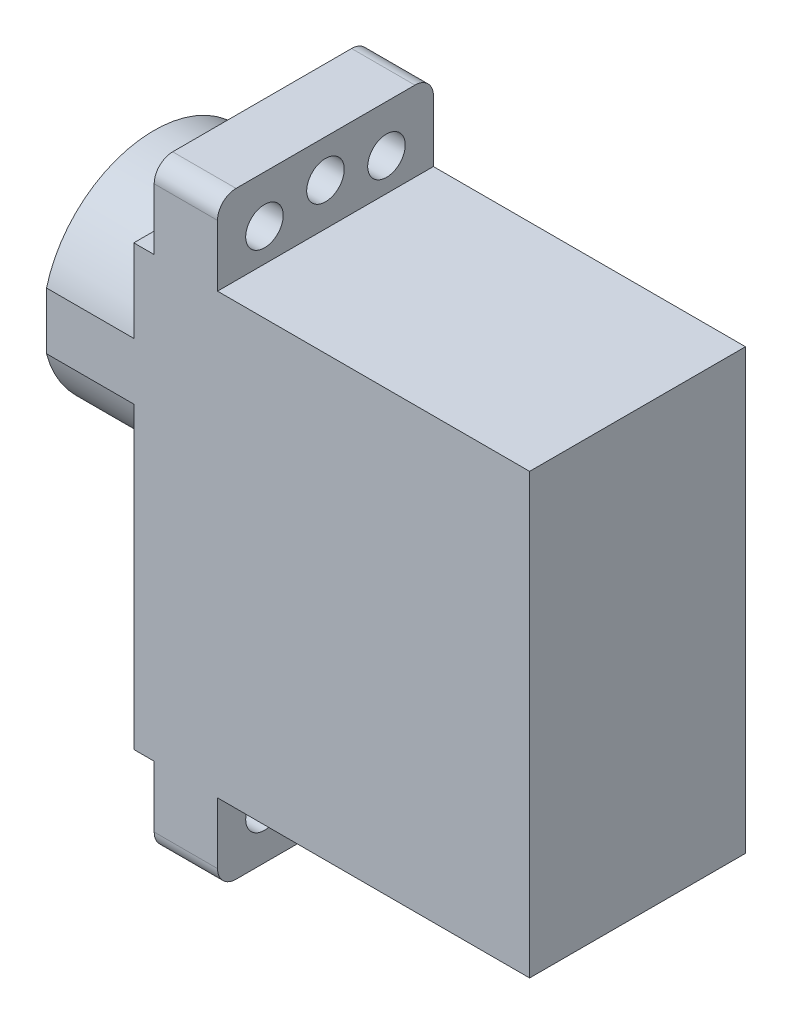
ISO-10303-21;
HEADER;
FILE_DESCRIPTION(('STEP AP214'),'2;1');
FILE_NAME('part.step','',(''),(''),'','','');
FILE_SCHEMA(('AUTOMOTIVE_DESIGN { 1 0 10303 214 1 1 1 1 }'));
ENDSEC;
DATA;
#1=APPLICATION_CONTEXT('core data for automotive mechanical design processes');
#2=APPLICATION_PROTOCOL_DEFINITION('international standard','automotive_design',2000,#1);
#3=PRODUCT_CONTEXT('',#1,'mechanical');
#4=PRODUCT('Part','Part','',(#3));
#5=PRODUCT_RELATED_PRODUCT_CATEGORY('part','',(#4));
#6=PRODUCT_DEFINITION_FORMATION('','',#4);
#7=PRODUCT_DEFINITION_CONTEXT('part definition',#1,'design');
#8=PRODUCT_DEFINITION('design','',#6,#7);
#9=PRODUCT_DEFINITION_SHAPE('','',#8);
#10=(LENGTH_UNIT() NAMED_UNIT(*) SI_UNIT(.MILLI.,.METRE.));
#11=(NAMED_UNIT(*) PLANE_ANGLE_UNIT() SI_UNIT($,.RADIAN.));
#12=(NAMED_UNIT(*) SI_UNIT($,.STERADIAN.) SOLID_ANGLE_UNIT());
#13=UNCERTAINTY_MEASURE_WITH_UNIT(LENGTH_MEASURE(1.E-05),#10,'distance_accuracy_value','');
#14=(GEOMETRIC_REPRESENTATION_CONTEXT(3) GLOBAL_UNCERTAINTY_ASSIGNED_CONTEXT((#13)) GLOBAL_UNIT_ASSIGNED_CONTEXT((#10,
#11,#12)) REPRESENTATION_CONTEXT('',''));
#15=CARTESIAN_POINT('',(0.,0.,0.));
#16=DIRECTION('',(0.,0.,1.));
#17=DIRECTION('',(1.,0.,0.));
#18=AXIS2_PLACEMENT_3D('',#15,#16,#17);
#19=CARTESIAN_POINT('',(-4.7244,17.7292,5.8646151009123));
#20=DIRECTION('',(1.,0.,0.));
#21=DIRECTION('',(0.,0.,-1.));
#22=AXIS2_PLACEMENT_3D('',#19,#20,#21);
#23=CYLINDRICAL_SURFACE('',#22,6.0198);
#24=DIRECTION('',(1.,0.,0.));
#25=VECTOR('',#24,1.);
#26=CARTESIAN_POINT('',(-4.7244,19.0872433565065,0.));
#27=LINE('',#26,#25);
#28=CARTESIAN_POINT('',(-4.7244,19.0872433565065,0.));
#29=VERTEX_POINT('',#28);
#30=CARTESIAN_POINT('',(0.,19.0872433565065,0.));
#31=VERTEX_POINT('',#30);
#32=EDGE_CURVE('E58',#29,#31,#27,.T.);
#33=ORIENTED_EDGE('',*,*,#32,.F.);
#34=CARTESIAN_POINT('',(-4.7244,17.7292,5.8646151009123));
#35=DIRECTION('',(-1.,0.,0.));
#36=DIRECTION('',(0.,0.,1.));
#37=AXIS2_PLACEMENT_3D('',#34,#35,#36);
#38=CIRCLE('',#37,6.0198);
#39=CARTESIAN_POINT('',(-4.7244,19.2695737975797,11.684));
#40=VERTEX_POINT('',#39);
#41=EDGE_CURVE('E389',#40,#29,#38,.T.);
#42=ORIENTED_EDGE('',*,*,#41,.F.);
#43=DIRECTION('',(1.,0.,0.));
#44=VECTOR('',#43,1.);
#45=CARTESIAN_POINT('',(-4.7244,19.2695737975797,11.684));
#46=LINE('',#45,#44);
#47=CARTESIAN_POINT('',(0.,19.2695737975797,11.684));
#48=VERTEX_POINT('',#47);
#49=EDGE_CURVE('E397',#48,#40,#46,.F.);
#50=ORIENTED_EDGE('',*,*,#49,.F.);
#51=CARTESIAN_POINT('',(0.,17.7292,5.8646151009123));
#52=DIRECTION('',(-1.,0.,0.));
#53=DIRECTION('',(0.,0.,1.));
#54=AXIS2_PLACEMENT_3D('',#51,#52,#53);
#55=CIRCLE('',#54,6.0198);
#56=CARTESIAN_POINT('',(0.,23.749,5.8646151009123));
#57=VERTEX_POINT('',#56);
#58=EDGE_CURVE('E45',#48,#57,#55,.T.);
#59=ORIENTED_EDGE('',*,*,#58,.T.);
#60=EDGE_CURVE('E11',#57,#31,#55,.T.);
#61=ORIENTED_EDGE('',*,*,#60,.T.);
#62=EDGE_LOOP('',(#33,#42,#50,#59,#61));
#63=FACE_BOUND('',#62,.T.);
#64=ADVANCED_FACE('F34',(#63),#23,.T.);
#65=DIRECTION('',(1.,0.,0.));
#66=VECTOR('',#65,1.);
#67=CARTESIAN_POINT('',(-4.7244,16.3711566434935,0.));
#68=LINE('',#67,#66);
#69=CARTESIAN_POINT('',(0.,16.3711566434935,0.));
#70=VERTEX_POINT('',#69);
#71=CARTESIAN_POINT('',(-4.7244,16.3711566434935,0.));
#72=VERTEX_POINT('',#71);
#73=EDGE_CURVE('E176',#70,#72,#68,.F.);
#74=ORIENTED_EDGE('',*,*,#73,.F.);
#75=CARTESIAN_POINT('',(0.,16.1888262024203,11.684));
#76=VERTEX_POINT('',#75);
#77=EDGE_CURVE('E43',#70,#76,#55,.T.);
#78=ORIENTED_EDGE('',*,*,#77,.T.);
#79=DIRECTION('',(1.,0.,0.));
#80=VECTOR('',#79,1.);
#81=CARTESIAN_POINT('',(-4.7244,16.1888262024203,11.684));
#82=LINE('',#81,#80);
#83=CARTESIAN_POINT('',(-4.7244,16.1888262024203,11.684));
#84=VERTEX_POINT('',#83);
#85=EDGE_CURVE('E393',#84,#76,#82,.T.);
#86=ORIENTED_EDGE('',*,*,#85,.F.);
#87=EDGE_CURVE('E180',#72,#84,#38,.T.);
#88=ORIENTED_EDGE('',*,*,#87,.F.);
#89=EDGE_LOOP('',(#74,#78,#86,#88));
#90=FACE_BOUND('',#89,.T.);
#91=ADVANCED_FACE('F178',(#90),#23,.T.);
#92=CARTESIAN_POINT('',(-4.7244,17.7292,5.8646151009123));
#93=DIRECTION('',(-1.,0.,0.));
#94=DIRECTION('',(0.,0.,1.));
#95=AXIS2_PLACEMENT_3D('',#92,#93,#94);
#96=PLANE('',#95);
#97=ORIENTED_EDGE('',*,*,#41,.T.);
#98=DIRECTION('',(0.,1.,0.));
#99=VECTOR('',#98,1.);
#100=CARTESIAN_POINT('',(-4.7244,0.,0.));
#101=LINE('',#100,#99);
#102=EDGE_CURVE('E183',#72,#29,#101,.T.);
#103=ORIENTED_EDGE('',*,*,#102,.F.);
#104=ORIENTED_EDGE('',*,*,#87,.T.);
#105=DIRECTION('',(0.,-1.,0.));
#106=VECTOR('',#105,1.);
#107=CARTESIAN_POINT('',(-4.7244,0.,11.684));
#108=LINE('',#107,#106);
#109=EDGE_CURVE('E399',#40,#84,#108,.T.);
#110=ORIENTED_EDGE('',*,*,#109,.F.);
#111=EDGE_LOOP('',(#97,#103,#104,#110));
#112=FACE_BOUND('',#111,.T.);
#113=ADVANCED_FACE('F407',(#112),#96,.T.);
#114=CARTESIAN_POINT('',(0.,0.,11.684));
#115=DIRECTION('',(1.,0.,0.));
#116=DIRECTION('',(0.,0.,-1.));
#117=AXIS2_PLACEMENT_3D('',#114,#115,#116);
#118=PLANE('',#117);
#119=ORIENTED_EDGE('',*,*,#58,.F.);
#120=DIRECTION('',(0.,-1.,0.));
#121=VECTOR('',#120,1.);
#122=CARTESIAN_POINT('',(0.,0.,11.684));
#123=LINE('',#122,#121);
#124=CARTESIAN_POINT('',(0.,23.749,11.684));
#125=VERTEX_POINT('',#124);
#126=EDGE_CURVE('E316',#125,#48,#123,.T.);
#127=ORIENTED_EDGE('',*,*,#126,.F.);
#128=DIRECTION('',(0.,0.,-1.));
#129=VECTOR('',#128,1.);
#130=CARTESIAN_POINT('',(0.,23.749,11.684));
#131=LINE('',#130,#129);
#132=EDGE_CURVE('E214',#125,#57,#131,.T.);
#133=ORIENTED_EDGE('',*,*,#132,.T.);
#134=EDGE_LOOP('',(#119,#127,#133));
#135=FACE_BOUND('',#134,.T.);
#136=ADVANCED_FACE('F411',(#135),#118,.F.);
#137=ORIENTED_EDGE('',*,*,#60,.F.);
#138=CARTESIAN_POINT('',(0.,23.749,0.));
#139=VERTEX_POINT('',#138);
#140=EDGE_CURVE('E218',#57,#139,#131,.T.);
#141=ORIENTED_EDGE('',*,*,#140,.T.);
#142=DIRECTION('',(0.,-1.,0.));
#143=VECTOR('',#142,1.);
#144=CARTESIAN_POINT('',(0.,0.,0.));
#145=LINE('',#144,#143);
#146=EDGE_CURVE('E197',#139,#31,#145,.T.);
#147=ORIENTED_EDGE('',*,*,#146,.T.);
#148=EDGE_LOOP('',(#137,#141,#147));
#149=FACE_BOUND('',#148,.T.);
#150=ADVANCED_FACE('F329',(#149),#118,.F.);
#151=ORIENTED_EDGE('',*,*,#77,.F.);
#152=CARTESIAN_POINT('',(0.,0.,0.));
#153=VERTEX_POINT('',#152);
#154=EDGE_CURVE('E189',#70,#153,#145,.T.);
#155=ORIENTED_EDGE('',*,*,#154,.T.);
#156=DIRECTION('',(0.,0.,-1.));
#157=VECTOR('',#156,1.);
#158=CARTESIAN_POINT('',(0.,0.,11.684));
#159=LINE('',#158,#157);
#160=CARTESIAN_POINT('',(0.,0.,11.684));
#161=VERTEX_POINT('',#160);
#162=EDGE_CURVE('E224',#161,#153,#159,.T.);
#163=ORIENTED_EDGE('',*,*,#162,.F.);
#164=EDGE_CURVE('E191',#76,#161,#123,.T.);
#165=ORIENTED_EDGE('',*,*,#164,.F.);
#166=EDGE_LOOP('',(#151,#155,#163,#165));
#167=FACE_BOUND('',#166,.T.);
#168=ADVANCED_FACE('F187',(#167),#118,.F.);
#169=CARTESIAN_POINT('',(0.,0.,11.684));
#170=DIRECTION('',(0.,1.,0.));
#171=DIRECTION('',(0.,0.,1.));
#172=AXIS2_PLACEMENT_3D('',#169,#170,#171);
#173=PLANE('',#172);
#174=DIRECTION('',(1.,0.,0.));
#175=VECTOR('',#174,1.);
#176=CARTESIAN_POINT('',(0.,0.,0.));
#177=LINE('',#176,#175);
#178=CARTESIAN_POINT('',(1.1034776,0.,0.));
#179=VERTEX_POINT('',#178);
#180=EDGE_CURVE('E195',#153,#179,#177,.T.);
#181=ORIENTED_EDGE('',*,*,#180,.T.);
#182=DIRECTION('',(0.,0.,1.));
#183=VECTOR('',#182,1.);
#184=CARTESIAN_POINT('',(1.1034776,0.,11.684));
#185=LINE('',#184,#183);
#186=CARTESIAN_POINT('',(1.1034776,0.,11.684));
#187=VERTEX_POINT('',#186);
#188=EDGE_CURVE('E198',#179,#187,#185,.T.);
#189=ORIENTED_EDGE('',*,*,#188,.T.);
#190=DIRECTION('',(1.,0.,0.));
#191=VECTOR('',#190,1.);
#192=CARTESIAN_POINT('',(0.,0.,11.684));
#193=LINE('',#192,#191);
#194=EDGE_CURVE('E293',#161,#187,#193,.T.);
#195=ORIENTED_EDGE('',*,*,#194,.F.);
#196=ORIENTED_EDGE('',*,*,#162,.T.);
#197=EDGE_LOOP('',(#181,#189,#195,#196));
#198=FACE_BOUND('',#197,.T.);
#199=ADVANCED_FACE('F430',(#198),#173,.F.);
#200=CARTESIAN_POINT('',(0.,23.749,11.684));
#201=DIRECTION('',(0.,-1.,0.));
#202=DIRECTION('',(0.,0.,-1.));
#203=AXIS2_PLACEMENT_3D('',#200,#201,#202);
#204=PLANE('',#203);
#205=DIRECTION('',(-1.,0.,0.));
#206=VECTOR('',#205,1.);
#207=CARTESIAN_POINT('',(0.,23.749,11.684));
#208=LINE('',#207,#206);
#209=CARTESIAN_POINT('',(1.1034776,23.749,11.684));
#210=VERTEX_POINT('',#209);
#211=EDGE_CURVE('E321',#210,#125,#208,.T.);
#212=ORIENTED_EDGE('',*,*,#211,.F.);
#213=DIRECTION('',(0.,0.,-1.));
#214=VECTOR('',#213,1.);
#215=CARTESIAN_POINT('',(1.1034776,23.749,11.684));
#216=LINE('',#215,#214);
#217=CARTESIAN_POINT('',(1.1034776,23.749,0.));
#218=VERTEX_POINT('',#217);
#219=EDGE_CURVE('E201',#210,#218,#216,.T.);
#220=ORIENTED_EDGE('',*,*,#219,.T.);
#221=DIRECTION('',(-1.,0.,0.));
#222=VECTOR('',#221,1.);
#223=CARTESIAN_POINT('',(0.,23.749,0.));
#224=LINE('',#223,#222);
#225=EDGE_CURVE('E210',#218,#139,#224,.T.);
#226=ORIENTED_EDGE('',*,*,#225,.T.);
#227=ORIENTED_EDGE('',*,*,#140,.F.);
#228=ORIENTED_EDGE('',*,*,#132,.F.);
#229=EDGE_LOOP('',(#212,#220,#226,#227,#228));
#230=FACE_BOUND('',#229,.T.);
#231=ADVANCED_FACE('F332',(#230),#204,.F.);
#232=CARTESIAN_POINT('',(4.5324776,0.,11.684));
#233=VERTEX_POINT('',#232);
#234=CARTESIAN_POINT('',(21.4234776,0.,11.684));
#235=VERTEX_POINT('',#234);
#236=EDGE_CURVE('E319',#233,#235,#193,.T.);
#237=ORIENTED_EDGE('',*,*,#236,.F.);
#238=DIRECTION('',(0.,0.,-1.));
#239=VECTOR('',#238,1.);
#240=CARTESIAN_POINT('',(4.5324776,0.,11.684));
#241=LINE('',#240,#239);
#242=CARTESIAN_POINT('',(4.5324776,0.,0.));
#243=VERTEX_POINT('',#242);
#244=EDGE_CURVE('E311',#233,#243,#241,.T.);
#245=ORIENTED_EDGE('',*,*,#244,.T.);
#246=CARTESIAN_POINT('',(21.4234776,0.,0.));
#247=VERTEX_POINT('',#246);
#248=EDGE_CURVE('E200',#243,#247,#177,.T.);
#249=ORIENTED_EDGE('',*,*,#248,.T.);
#250=DIRECTION('',(0.,0.,-1.));
#251=VECTOR('',#250,1.);
#252=CARTESIAN_POINT('',(21.4234776,0.,11.684));
#253=LINE('',#252,#251);
#254=EDGE_CURVE('E221',#235,#247,#253,.T.);
#255=ORIENTED_EDGE('',*,*,#254,.F.);
#256=EDGE_LOOP('',(#237,#245,#249,#255));
#257=FACE_BOUND('',#256,.T.);
#258=ADVANCED_FACE('F425',(#257),#173,.F.);
#259=CARTESIAN_POINT('',(21.4234776,0.,11.684));
#260=DIRECTION('',(-1.,0.,0.));
#261=DIRECTION('',(0.,0.,1.));
#262=AXIS2_PLACEMENT_3D('',#259,#260,#261);
#263=PLANE('',#262);
#264=DIRECTION('',(0.,1.,0.));
#265=VECTOR('',#264,1.);
#266=CARTESIAN_POINT('',(21.4234776,0.,0.));
#267=LINE('',#266,#265);
#268=CARTESIAN_POINT('',(21.4234776,23.749,0.));
#269=VERTEX_POINT('',#268);
#270=EDGE_CURVE('E208',#247,#269,#267,.T.);
#271=ORIENTED_EDGE('',*,*,#270,.T.);
#272=DIRECTION('',(0.,0.,-1.));
#273=VECTOR('',#272,1.);
#274=CARTESIAN_POINT('',(21.4234776,23.749,11.684));
#275=LINE('',#274,#273);
#276=CARTESIAN_POINT('',(21.4234776,23.749,11.684));
#277=VERTEX_POINT('',#276);
#278=EDGE_CURVE('E217',#277,#269,#275,.T.);
#279=ORIENTED_EDGE('',*,*,#278,.F.);
#280=DIRECTION('',(0.,1.,0.));
#281=VECTOR('',#280,1.);
#282=CARTESIAN_POINT('',(21.4234776,0.,11.684));
#283=LINE('',#282,#281);
#284=EDGE_CURVE('E320',#235,#277,#283,.T.);
#285=ORIENTED_EDGE('',*,*,#284,.F.);
#286=ORIENTED_EDGE('',*,*,#254,.T.);
#287=EDGE_LOOP('',(#271,#279,#285,#286));
#288=FACE_BOUND('',#287,.T.);
#289=ADVANCED_FACE('F422',(#288),#263,.F.);
#290=CARTESIAN_POINT('',(4.5324776,23.749,0.));
#291=VERTEX_POINT('',#290);
#292=EDGE_CURVE('E211',#269,#291,#224,.T.);
#293=ORIENTED_EDGE('',*,*,#292,.T.);
#294=DIRECTION('',(0.,0.,1.));
#295=VECTOR('',#294,1.);
#296=CARTESIAN_POINT('',(4.5324776,23.749,11.684));
#297=LINE('',#296,#295);
#298=CARTESIAN_POINT('',(4.5324776,23.749,11.684));
#299=VERTEX_POINT('',#298);
#300=EDGE_CURVE('E297',#291,#299,#297,.T.);
#301=ORIENTED_EDGE('',*,*,#300,.T.);
#302=EDGE_CURVE('E205',#277,#299,#208,.T.);
#303=ORIENTED_EDGE('',*,*,#302,.F.);
#304=ORIENTED_EDGE('',*,*,#278,.T.);
#305=EDGE_LOOP('',(#293,#301,#303,#304));
#306=FACE_BOUND('',#305,.T.);
#307=ADVANCED_FACE('F418',(#306),#204,.F.);
#308=CARTESIAN_POINT('',(0.,23.749,11.684));
#309=DIRECTION('',(0.,0.,-1.));
#310=DIRECTION('',(-1.,0.,0.));
#311=AXIS2_PLACEMENT_3D('',#308,#309,#310);
#312=PLANE('',#311);
#313=DIRECTION('',(0.,-1.,0.));
#314=VECTOR('',#313,1.);
#315=CARTESIAN_POINT('',(4.5324776,28.067,11.684));
#316=LINE('',#315,#314);
#317=CARTESIAN_POINT('',(4.5324776,27.067,11.684));
#318=VERTEX_POINT('',#317);
#319=EDGE_CURVE('E295',#318,#299,#316,.T.);
#320=ORIENTED_EDGE('',*,*,#319,.F.);
#321=DIRECTION('',(-1.,0.,0.));
#322=VECTOR('',#321,1.);
#323=CARTESIAN_POINT('',(1.1034776,27.067,11.684));
#324=LINE('',#323,#322);
#325=CARTESIAN_POINT('',(1.1034776,27.067,11.684));
#326=VERTEX_POINT('',#325);
#327=EDGE_CURVE('E228',#318,#326,#324,.T.);
#328=ORIENTED_EDGE('',*,*,#327,.T.);
#329=DIRECTION('',(0.,-1.,0.));
#330=VECTOR('',#329,1.);
#331=CARTESIAN_POINT('',(1.1034776,28.067,11.684));
#332=LINE('',#331,#330);
#333=EDGE_CURVE('E294',#326,#210,#332,.T.);
#334=ORIENTED_EDGE('',*,*,#333,.T.);
#335=ORIENTED_EDGE('',*,*,#211,.T.);
#336=ORIENTED_EDGE('',*,*,#126,.T.);
#337=ORIENTED_EDGE('',*,*,#49,.T.);
#338=ORIENTED_EDGE('',*,*,#109,.T.);
#339=ORIENTED_EDGE('',*,*,#85,.T.);
#340=ORIENTED_EDGE('',*,*,#164,.T.);
#341=ORIENTED_EDGE('',*,*,#194,.T.);
#342=CARTESIAN_POINT('',(1.1034776,-3.318,11.684));
#343=VERTEX_POINT('',#342);
#344=EDGE_CURVE('E287',#187,#343,#332,.T.);
#345=ORIENTED_EDGE('',*,*,#344,.T.);
#346=DIRECTION('',(-1.,0.,0.));
#347=VECTOR('',#346,1.);
#348=CARTESIAN_POINT('',(0.,-3.318,11.684));
#349=LINE('',#348,#347);
#350=CARTESIAN_POINT('',(4.5324776,-3.318,11.684));
#351=VERTEX_POINT('',#350);
#352=EDGE_CURVE('E226',#343,#351,#349,.F.);
#353=ORIENTED_EDGE('',*,*,#352,.T.);
#354=EDGE_CURVE('E269',#233,#351,#316,.T.);
#355=ORIENTED_EDGE('',*,*,#354,.F.);
#356=ORIENTED_EDGE('',*,*,#236,.T.);
#357=ORIENTED_EDGE('',*,*,#284,.T.);
#358=ORIENTED_EDGE('',*,*,#302,.T.);
#359=EDGE_LOOP('',(#320,#328,#334,#335,#336,#337,#338,#339,#340,#341,#345,#353,#355,#356,#357,#358));
#360=FACE_BOUND('',#359,.T.);
#361=ADVANCED_FACE('F291',(#360),#312,.F.);
#362=CARTESIAN_POINT('',(0.,23.749,0.));
#363=DIRECTION('',(0.,0.,-1.));
#364=DIRECTION('',(-1.,0.,0.));
#365=AXIS2_PLACEMENT_3D('',#362,#363,#364);
#366=PLANE('',#365);
#367=DIRECTION('',(0.,-1.,0.));
#368=VECTOR('',#367,1.);
#369=CARTESIAN_POINT('',(1.1034776,28.067,0.));
#370=LINE('',#369,#368);
#371=CARTESIAN_POINT('',(1.1034776,27.067,0.));
#372=VERTEX_POINT('',#371);
#373=EDGE_CURVE('E306',#372,#218,#370,.T.);
#374=ORIENTED_EDGE('',*,*,#373,.F.);
#375=DIRECTION('',(1.,0.,0.));
#376=VECTOR('',#375,1.);
#377=CARTESIAN_POINT('',(0.,27.067,0.));
#378=LINE('',#377,#376);
#379=CARTESIAN_POINT('',(4.5324776,27.067,0.));
#380=VERTEX_POINT('',#379);
#381=EDGE_CURVE('E245',#372,#380,#378,.T.);
#382=ORIENTED_EDGE('',*,*,#381,.T.);
#383=DIRECTION('',(0.,-1.,0.));
#384=VECTOR('',#383,1.);
#385=CARTESIAN_POINT('',(4.5324776,28.067,0.));
#386=LINE('',#385,#384);
#387=EDGE_CURVE('E303',#380,#291,#386,.T.);
#388=ORIENTED_EDGE('',*,*,#387,.T.);
#389=ORIENTED_EDGE('',*,*,#292,.F.);
#390=ORIENTED_EDGE('',*,*,#270,.F.);
#391=ORIENTED_EDGE('',*,*,#248,.F.);
#392=CARTESIAN_POINT('',(4.5324776,-3.318,0.));
#393=VERTEX_POINT('',#392);
#394=EDGE_CURVE('E305',#243,#393,#386,.T.);
#395=ORIENTED_EDGE('',*,*,#394,.T.);
#396=DIRECTION('',(1.,0.,0.));
#397=VECTOR('',#396,1.);
#398=CARTESIAN_POINT('',(1.1034776,-3.318,0.));
#399=LINE('',#398,#397);
#400=CARTESIAN_POINT('',(1.1034776,-3.318,0.));
#401=VERTEX_POINT('',#400);
#402=EDGE_CURVE('E243',#393,#401,#399,.F.);
#403=ORIENTED_EDGE('',*,*,#402,.T.);
#404=EDGE_CURVE('E308',#179,#401,#370,.T.);
#405=ORIENTED_EDGE('',*,*,#404,.F.);
#406=ORIENTED_EDGE('',*,*,#180,.F.);
#407=ORIENTED_EDGE('',*,*,#154,.F.);
#408=ORIENTED_EDGE('',*,*,#73,.T.);
#409=ORIENTED_EDGE('',*,*,#102,.T.);
#410=ORIENTED_EDGE('',*,*,#32,.T.);
#411=ORIENTED_EDGE('',*,*,#146,.F.);
#412=ORIENTED_EDGE('',*,*,#225,.F.);
#413=EDGE_LOOP('',(#374,#382,#388,#389,#390,#391,#395,#403,#405,#406,#407,#408,#409,#410,#411,#412));
#414=FACE_BOUND('',#413,.T.);
#415=ADVANCED_FACE('F193',(#414),#366,.T.);
#416=CARTESIAN_POINT('',(1.1034776,28.067,11.684));
#417=DIRECTION('',(0.,1.,0.));
#418=DIRECTION('',(0.,0.,1.));
#419=AXIS2_PLACEMENT_3D('',#416,#417,#418);
#420=PLANE('',#419);
#421=DIRECTION('',(0.,0.,-1.));
#422=VECTOR('',#421,1.);
#423=CARTESIAN_POINT('',(1.1034776,28.067,0.));
#424=LINE('',#423,#422);
#425=CARTESIAN_POINT('',(1.1034776,28.067,10.684));
#426=VERTEX_POINT('',#425);
#427=CARTESIAN_POINT('',(1.1034776,28.067,0.999999999999997));
#428=VERTEX_POINT('',#427);
#429=EDGE_CURVE('E278',#426,#428,#424,.T.);
#430=ORIENTED_EDGE('',*,*,#429,.F.);
#431=DIRECTION('',(-1.,0.,0.));
#432=VECTOR('',#431,1.);
#433=CARTESIAN_POINT('',(4.5324776,28.067,10.684));
#434=LINE('',#433,#432);
#435=CARTESIAN_POINT('',(4.5324776,28.067,10.684));
#436=VERTEX_POINT('',#435);
#437=EDGE_CURVE('E237',#426,#436,#434,.F.);
#438=ORIENTED_EDGE('',*,*,#437,.T.);
#439=DIRECTION('',(0.,0.,1.));
#440=VECTOR('',#439,1.);
#441=CARTESIAN_POINT('',(4.5324776,28.067,0.));
#442=LINE('',#441,#440);
#443=CARTESIAN_POINT('',(4.5324776,28.067,0.999999999999997));
#444=VERTEX_POINT('',#443);
#445=EDGE_CURVE('E300',#444,#436,#442,.T.);
#446=ORIENTED_EDGE('',*,*,#445,.F.);
#447=DIRECTION('',(1.,0.,0.));
#448=VECTOR('',#447,1.);
#449=CARTESIAN_POINT('',(1.1034776,28.067,0.999999999999997));
#450=LINE('',#449,#448);
#451=EDGE_CURVE('E235',#444,#428,#450,.F.);
#452=ORIENTED_EDGE('',*,*,#451,.T.);
#453=EDGE_LOOP('',(#430,#438,#446,#452));
#454=FACE_BOUND('',#453,.T.);
#455=ADVANCED_FACE('F349',(#454),#420,.T.);
#456=CARTESIAN_POINT('',(4.5324776,28.067,0.));
#457=DIRECTION('',(1.,0.,0.));
#458=DIRECTION('',(0.,0.,-1.));
#459=AXIS2_PLACEMENT_3D('',#456,#457,#458);
#460=PLANE('',#459);
#461=CARTESIAN_POINT('',(4.5324776,25.527,2.54));
#462=DIRECTION('',(1.,0.,0.));
#463=DIRECTION('',(0.,0.,-1.));
#464=AXIS2_PLACEMENT_3D('',#461,#462,#463);
#465=CIRCLE('',#464,1.016);
#466=CARTESIAN_POINT('',(4.5324776,25.527,1.524));
#467=VERTEX_POINT('',#466);
#468=EDGE_CURVE('E386',#467,#467,#465,.F.);
#469=ORIENTED_EDGE('',*,*,#468,.T.);
#470=EDGE_LOOP('',(#469));
#471=FACE_BOUND('',#470,.T.);
#472=CARTESIAN_POINT('',(4.5324776,26.035,5.842));
#473=DIRECTION('',(1.,0.,0.));
#474=DIRECTION('',(0.,0.,-1.));
#475=AXIS2_PLACEMENT_3D('',#472,#473,#474);
#476=CIRCLE('',#475,1.016);
#477=CARTESIAN_POINT('',(4.5324776,26.035,4.826));
#478=VERTEX_POINT('',#477);
#479=EDGE_CURVE('E380',#478,#478,#476,.F.);
#480=ORIENTED_EDGE('',*,*,#479,.T.);
#481=EDGE_LOOP('',(#480));
#482=FACE_BOUND('',#481,.T.);
#483=CARTESIAN_POINT('',(4.5324776,25.527,9.144));
#484=DIRECTION('',(1.,0.,0.));
#485=DIRECTION('',(0.,0.,-1.));
#486=AXIS2_PLACEMENT_3D('',#483,#484,#485);
#487=CIRCLE('',#486,1.016);
#488=CARTESIAN_POINT('',(4.5324776,25.527,8.128));
#489=VERTEX_POINT('',#488);
#490=EDGE_CURVE('E374',#489,#489,#487,.F.);
#491=ORIENTED_EDGE('',*,*,#490,.T.);
#492=EDGE_LOOP('',(#491));
#493=FACE_BOUND('',#492,.T.);
#494=ORIENTED_EDGE('',*,*,#445,.T.);
#495=CARTESIAN_POINT('',(4.5324776,27.067,10.684));
#496=DIRECTION('',(1.,0.,0.));
#497=DIRECTION('',(0.,0.,-1.));
#498=AXIS2_PLACEMENT_3D('',#495,#496,#497);
#499=CIRCLE('',#498,0.999999999999997);
#500=EDGE_CURVE('E241',#436,#318,#499,.T.);
#501=ORIENTED_EDGE('',*,*,#500,.T.);
#502=ORIENTED_EDGE('',*,*,#319,.T.);
#503=ORIENTED_EDGE('',*,*,#300,.F.);
#504=ORIENTED_EDGE('',*,*,#387,.F.);
#505=CARTESIAN_POINT('',(4.5324776,27.067,0.999999999999997));
#506=DIRECTION('',(1.,0.,0.));
#507=DIRECTION('',(0.,0.,-1.));
#508=AXIS2_PLACEMENT_3D('',#505,#506,#507);
#509=CIRCLE('',#508,0.999999999999997);
#510=EDGE_CURVE('E239',#380,#444,#509,.T.);
#511=ORIENTED_EDGE('',*,*,#510,.T.);
#512=EDGE_LOOP('',(#494,#501,#502,#503,#504,#511));
#513=FACE_BOUND('',#512,.T.);
#514=ADVANCED_FACE('F344',(#471,#482,#493,#513),#460,.T.);
#515=CARTESIAN_POINT('',(1.1034776,28.067,0.));
#516=DIRECTION('',(-1.,0.,0.));
#517=DIRECTION('',(0.,0.,1.));
#518=AXIS2_PLACEMENT_3D('',#515,#516,#517);
#519=PLANE('',#518);
#520=CARTESIAN_POINT('',(1.1034776,25.527,2.54));
#521=DIRECTION('',(-1.,0.,0.));
#522=DIRECTION('',(0.,0.,-1.));
#523=AXIS2_PLACEMENT_3D('',#520,#521,#522);
#524=CIRCLE('',#523,1.016);
#525=CARTESIAN_POINT('',(1.1034776,25.527,1.524));
#526=VERTEX_POINT('',#525);
#527=EDGE_CURVE('E383',#526,#526,#524,.T.);
#528=ORIENTED_EDGE('',*,*,#527,.F.);
#529=EDGE_LOOP('',(#528));
#530=FACE_BOUND('',#529,.T.);
#531=CARTESIAN_POINT('',(1.1034776,26.035,5.842));
#532=DIRECTION('',(-1.,0.,0.));
#533=DIRECTION('',(0.,0.,-1.));
#534=AXIS2_PLACEMENT_3D('',#531,#532,#533);
#535=CIRCLE('',#534,1.016);
#536=CARTESIAN_POINT('',(1.1034776,26.035,4.826));
#537=VERTEX_POINT('',#536);
#538=EDGE_CURVE('E377',#537,#537,#535,.T.);
#539=ORIENTED_EDGE('',*,*,#538,.F.);
#540=EDGE_LOOP('',(#539));
#541=FACE_BOUND('',#540,.T.);
#542=CARTESIAN_POINT('',(1.1034776,25.527,9.144));
#543=DIRECTION('',(-1.,0.,0.));
#544=DIRECTION('',(0.,0.,-1.));
#545=AXIS2_PLACEMENT_3D('',#542,#543,#544);
#546=CIRCLE('',#545,1.016);
#547=CARTESIAN_POINT('',(1.1034776,25.527,8.128));
#548=VERTEX_POINT('',#547);
#549=EDGE_CURVE('E371',#548,#548,#546,.T.);
#550=ORIENTED_EDGE('',*,*,#549,.F.);
#551=EDGE_LOOP('',(#550));
#552=FACE_BOUND('',#551,.T.);
#553=ORIENTED_EDGE('',*,*,#333,.F.);
#554=CARTESIAN_POINT('',(1.1034776,27.067,10.684));
#555=DIRECTION('',(-1.,0.,0.));
#556=DIRECTION('',(0.,0.,1.));
#557=AXIS2_PLACEMENT_3D('',#554,#555,#556);
#558=CIRCLE('',#557,0.999999999999997);
#559=EDGE_CURVE('E233',#326,#426,#558,.T.);
#560=ORIENTED_EDGE('',*,*,#559,.T.);
#561=ORIENTED_EDGE('',*,*,#429,.T.);
#562=CARTESIAN_POINT('',(1.1034776,27.067,0.999999999999997));
#563=DIRECTION('',(-1.,0.,0.));
#564=DIRECTION('',(0.,0.,1.));
#565=AXIS2_PLACEMENT_3D('',#562,#563,#564);
#566=CIRCLE('',#565,0.999999999999997);
#567=EDGE_CURVE('E231',#428,#372,#566,.T.);
#568=ORIENTED_EDGE('',*,*,#567,.T.);
#569=ORIENTED_EDGE('',*,*,#373,.T.);
#570=ORIENTED_EDGE('',*,*,#219,.F.);
#571=EDGE_LOOP('',(#553,#560,#561,#568,#569,#570));
#572=FACE_BOUND('',#571,.T.);
#573=ADVANCED_FACE('F413',(#530,#541,#552,#572),#519,.T.);
#574=CARTESIAN_POINT('',(1.1034776,-1.778,9.144));
#575=DIRECTION('',(-1.,0.,0.));
#576=DIRECTION('',(0.,0.,1.));
#577=AXIS2_PLACEMENT_3D('',#574,#575,#576);
#578=CIRCLE('',#577,1.016);
#579=CARTESIAN_POINT('',(1.1034776,-1.778,10.16));
#580=VERTEX_POINT('',#579);
#581=EDGE_CURVE('E365',#580,#580,#578,.T.);
#582=ORIENTED_EDGE('',*,*,#581,.F.);
#583=EDGE_LOOP('',(#582));
#584=FACE_BOUND('',#583,.T.);
#585=CARTESIAN_POINT('',(1.1034776,-2.286,5.842));
#586=DIRECTION('',(-1.,0.,0.));
#587=DIRECTION('',(0.,0.,1.));
#588=AXIS2_PLACEMENT_3D('',#585,#586,#587);
#589=CIRCLE('',#588,1.016);
#590=CARTESIAN_POINT('',(1.1034776,-2.286,6.85800000000001));
#591=VERTEX_POINT('',#590);
#592=EDGE_CURVE('E359',#591,#591,#589,.T.);
#593=ORIENTED_EDGE('',*,*,#592,.F.);
#594=EDGE_LOOP('',(#593));
#595=FACE_BOUND('',#594,.T.);
#596=CARTESIAN_POINT('',(1.1034776,-1.778,2.54));
#597=DIRECTION('',(-1.,0.,0.));
#598=DIRECTION('',(0.,0.,1.));
#599=AXIS2_PLACEMENT_3D('',#596,#597,#598);
#600=CIRCLE('',#599,1.016);
#601=CARTESIAN_POINT('',(1.1034776,-1.778,3.556));
#602=VERTEX_POINT('',#601);
#603=EDGE_CURVE('E355',#602,#602,#600,.T.);
#604=ORIENTED_EDGE('',*,*,#603,.F.);
#605=EDGE_LOOP('',(#604));
#606=FACE_BOUND('',#605,.T.);
#607=DIRECTION('',(0.,0.,-1.));
#608=VECTOR('',#607,1.);
#609=CARTESIAN_POINT('',(1.1034776,-4.318,0.));
#610=LINE('',#609,#608);
#611=CARTESIAN_POINT('',(1.1034776,-4.318,10.684));
#612=VERTEX_POINT('',#611);
#613=CARTESIAN_POINT('',(1.1034776,-4.318,0.999999999999997));
#614=VERTEX_POINT('',#613);
#615=EDGE_CURVE('E279',#612,#614,#610,.T.);
#616=ORIENTED_EDGE('',*,*,#615,.F.);
#617=CARTESIAN_POINT('',(1.1034776,-3.318,10.684));
#618=DIRECTION('',(-1.,0.,0.));
#619=DIRECTION('',(0.,0.,1.));
#620=AXIS2_PLACEMENT_3D('',#617,#618,#619);
#621=CIRCLE('',#620,0.999999999999997);
#622=EDGE_CURVE('E256',#612,#343,#621,.T.);
#623=ORIENTED_EDGE('',*,*,#622,.T.);
#624=ORIENTED_EDGE('',*,*,#344,.F.);
#625=ORIENTED_EDGE('',*,*,#188,.F.);
#626=ORIENTED_EDGE('',*,*,#404,.T.);
#627=CARTESIAN_POINT('',(1.1034776,-3.318,0.999999999999997));
#628=DIRECTION('',(-1.,0.,0.));
#629=DIRECTION('',(0.,0.,1.));
#630=AXIS2_PLACEMENT_3D('',#627,#628,#629);
#631=CIRCLE('',#630,0.999999999999997);
#632=EDGE_CURVE('E254',#401,#614,#631,.T.);
#633=ORIENTED_EDGE('',*,*,#632,.T.);
#634=EDGE_LOOP('',(#616,#623,#624,#625,#626,#633));
#635=FACE_BOUND('',#634,.T.);
#636=ADVANCED_FACE('F285',(#584,#595,#606,#635),#519,.T.);
#637=CARTESIAN_POINT('',(4.5324776,-1.778,9.144));
#638=DIRECTION('',(1.,0.,0.));
#639=DIRECTION('',(0.,0.,-1.));
#640=AXIS2_PLACEMENT_3D('',#637,#638,#639);
#641=CIRCLE('',#640,1.016);
#642=CARTESIAN_POINT('',(4.5324776,-1.778,8.128));
#643=VERTEX_POINT('',#642);
#644=EDGE_CURVE('E368',#643,#643,#641,.F.);
#645=ORIENTED_EDGE('',*,*,#644,.T.);
#646=EDGE_LOOP('',(#645));
#647=FACE_BOUND('',#646,.T.);
#648=CARTESIAN_POINT('',(4.5324776,-2.286,5.842));
#649=DIRECTION('',(1.,0.,0.));
#650=DIRECTION('',(0.,0.,-1.));
#651=AXIS2_PLACEMENT_3D('',#648,#649,#650);
#652=CIRCLE('',#651,1.016);
#653=CARTESIAN_POINT('',(4.5324776,-2.286,4.826));
#654=VERTEX_POINT('',#653);
#655=EDGE_CURVE('E362',#654,#654,#652,.F.);
#656=ORIENTED_EDGE('',*,*,#655,.T.);
#657=EDGE_LOOP('',(#656));
#658=FACE_BOUND('',#657,.T.);
#659=CARTESIAN_POINT('',(4.5324776,-1.778,2.54));
#660=DIRECTION('',(1.,0.,0.));
#661=DIRECTION('',(0.,0.,-1.));
#662=AXIS2_PLACEMENT_3D('',#659,#660,#661);
#663=CIRCLE('',#662,1.016);
#664=CARTESIAN_POINT('',(4.5324776,-1.778,1.524));
#665=VERTEX_POINT('',#664);
#666=EDGE_CURVE('E356',#665,#665,#663,.F.);
#667=ORIENTED_EDGE('',*,*,#666,.T.);
#668=EDGE_LOOP('',(#667));
#669=FACE_BOUND('',#668,.T.);
#670=ORIENTED_EDGE('',*,*,#354,.T.);
#671=CARTESIAN_POINT('',(4.5324776,-3.318,10.684));
#672=DIRECTION('',(1.,0.,0.));
#673=DIRECTION('',(0.,0.,-1.));
#674=AXIS2_PLACEMENT_3D('',#671,#672,#673);
#675=CIRCLE('',#674,0.999999999999997);
#676=CARTESIAN_POINT('',(4.5324776,-4.318,10.684));
#677=VERTEX_POINT('',#676);
#678=EDGE_CURVE('E38',#351,#677,#675,.T.);
#679=ORIENTED_EDGE('',*,*,#678,.T.);
#680=DIRECTION('',(0.,0.,1.));
#681=VECTOR('',#680,1.);
#682=CARTESIAN_POINT('',(4.5324776,-4.318,0.));
#683=LINE('',#682,#681);
#684=CARTESIAN_POINT('',(4.5324776,-4.318,0.999999999999997));
#685=VERTEX_POINT('',#684);
#686=EDGE_CURVE('E266',#685,#677,#683,.T.);
#687=ORIENTED_EDGE('',*,*,#686,.F.);
#688=CARTESIAN_POINT('',(4.5324776,-3.318,0.999999999999997));
#689=DIRECTION('',(1.,0.,0.));
#690=DIRECTION('',(0.,0.,-1.));
#691=AXIS2_PLACEMENT_3D('',#688,#689,#690);
#692=CIRCLE('',#691,0.999999999999997);
#693=EDGE_CURVE('E257',#685,#393,#692,.T.);
#694=ORIENTED_EDGE('',*,*,#693,.T.);
#695=ORIENTED_EDGE('',*,*,#394,.F.);
#696=ORIENTED_EDGE('',*,*,#244,.F.);
#697=EDGE_LOOP('',(#670,#679,#687,#694,#695,#696));
#698=FACE_BOUND('',#697,.T.);
#699=ADVANCED_FACE('F265',(#647,#658,#669,#698),#460,.T.);
#700=CARTESIAN_POINT('',(1.1034776,-4.318,11.684));
#701=DIRECTION('',(0.,1.,0.));
#702=DIRECTION('',(0.,0.,1.));
#703=AXIS2_PLACEMENT_3D('',#700,#701,#702);
#704=PLANE('',#703);
#705=ORIENTED_EDGE('',*,*,#686,.T.);
#706=DIRECTION('',(-1.,0.,0.));
#707=VECTOR('',#706,1.);
#708=CARTESIAN_POINT('',(1.1034776,-4.318,10.684));
#709=LINE('',#708,#707);
#710=EDGE_CURVE('E251',#677,#612,#709,.T.);
#711=ORIENTED_EDGE('',*,*,#710,.T.);
#712=ORIENTED_EDGE('',*,*,#615,.T.);
#713=DIRECTION('',(1.,0.,0.));
#714=VECTOR('',#713,1.);
#715=CARTESIAN_POINT('',(4.5324776,-4.318,0.999999999999997));
#716=LINE('',#715,#714);
#717=EDGE_CURVE('E248',#614,#685,#716,.T.);
#718=ORIENTED_EDGE('',*,*,#717,.T.);
#719=EDGE_LOOP('',(#705,#711,#712,#718));
#720=FACE_BOUND('',#719,.T.);
#721=ADVANCED_FACE('F274',(#720),#704,.F.);
#722=CARTESIAN_POINT('',(21.4244776,-1.778,2.54));
#723=DIRECTION('',(-1.,0.,0.));
#724=DIRECTION('',(0.,0.,1.));
#725=AXIS2_PLACEMENT_3D('',#722,#723,#724);
#726=CYLINDRICAL_SURFACE('',#725,1.016);
#727=ORIENTED_EDGE('',*,*,#666,.F.);
#728=EDGE_LOOP('',(#727));
#729=FACE_BOUND('',#728,.T.);
#730=ORIENTED_EDGE('',*,*,#603,.T.);
#731=EDGE_LOOP('',(#730));
#732=FACE_BOUND('',#731,.T.);
#733=ADVANCED_FACE('F467',(#729,#732),#726,.F.);
#734=CARTESIAN_POINT('',(21.4244776,-2.286,5.842));
#735=DIRECTION('',(-1.,0.,0.));
#736=DIRECTION('',(0.,0.,1.));
#737=AXIS2_PLACEMENT_3D('',#734,#735,#736);
#738=CYLINDRICAL_SURFACE('',#737,1.016);
#739=ORIENTED_EDGE('',*,*,#655,.F.);
#740=EDGE_LOOP('',(#739));
#741=FACE_BOUND('',#740,.T.);
#742=ORIENTED_EDGE('',*,*,#592,.T.);
#743=EDGE_LOOP('',(#742));
#744=FACE_BOUND('',#743,.T.);
#745=ADVANCED_FACE('F463',(#741,#744),#738,.F.);
#746=CARTESIAN_POINT('',(21.4244776,-1.778,9.144));
#747=DIRECTION('',(-1.,0.,0.));
#748=DIRECTION('',(0.,0.,1.));
#749=AXIS2_PLACEMENT_3D('',#746,#747,#748);
#750=CYLINDRICAL_SURFACE('',#749,1.016);
#751=ORIENTED_EDGE('',*,*,#644,.F.);
#752=EDGE_LOOP('',(#751));
#753=FACE_BOUND('',#752,.T.);
#754=ORIENTED_EDGE('',*,*,#581,.T.);
#755=EDGE_LOOP('',(#754));
#756=FACE_BOUND('',#755,.T.);
#757=ADVANCED_FACE('F459',(#753,#756),#750,.F.);
#758=CARTESIAN_POINT('',(21.4244776,25.527,9.144));
#759=DIRECTION('',(-1.,0.,0.));
#760=DIRECTION('',(0.,0.,1.));
#761=AXIS2_PLACEMENT_3D('',#758,#759,#760);
#762=CYLINDRICAL_SURFACE('',#761,1.016);
#763=ORIENTED_EDGE('',*,*,#490,.F.);
#764=EDGE_LOOP('',(#763));
#765=FACE_BOUND('',#764,.T.);
#766=ORIENTED_EDGE('',*,*,#549,.T.);
#767=EDGE_LOOP('',(#766));
#768=FACE_BOUND('',#767,.T.);
#769=ADVANCED_FACE('F455',(#765,#768),#762,.F.);
#770=CARTESIAN_POINT('',(21.4244776,26.035,5.842));
#771=DIRECTION('',(-1.,0.,0.));
#772=DIRECTION('',(0.,0.,1.));
#773=AXIS2_PLACEMENT_3D('',#770,#771,#772);
#774=CYLINDRICAL_SURFACE('',#773,1.016);
#775=ORIENTED_EDGE('',*,*,#479,.F.);
#776=EDGE_LOOP('',(#775));
#777=FACE_BOUND('',#776,.T.);
#778=ORIENTED_EDGE('',*,*,#538,.T.);
#779=EDGE_LOOP('',(#778));
#780=FACE_BOUND('',#779,.T.);
#781=ADVANCED_FACE('F451',(#777,#780),#774,.F.);
#782=CARTESIAN_POINT('',(21.4244776,25.527,2.54));
#783=DIRECTION('',(-1.,0.,0.));
#784=DIRECTION('',(0.,0.,1.));
#785=AXIS2_PLACEMENT_3D('',#782,#783,#784);
#786=CYLINDRICAL_SURFACE('',#785,1.016);
#787=ORIENTED_EDGE('',*,*,#468,.F.);
#788=EDGE_LOOP('',(#787));
#789=FACE_BOUND('',#788,.T.);
#790=ORIENTED_EDGE('',*,*,#527,.T.);
#791=EDGE_LOOP('',(#790));
#792=FACE_BOUND('',#791,.T.);
#793=ADVANCED_FACE('F448',(#789,#792),#786,.F.);
#794=CARTESIAN_POINT('',(0.,27.067,10.684));
#795=DIRECTION('',(1.,0.,0.));
#796=DIRECTION('',(0.,0.,-1.));
#797=AXIS2_PLACEMENT_3D('',#794,#795,#796);
#798=CYLINDRICAL_SURFACE('',#797,0.999999999999997);
#799=ORIENTED_EDGE('',*,*,#500,.F.);
#800=ORIENTED_EDGE('',*,*,#437,.F.);
#801=ORIENTED_EDGE('',*,*,#559,.F.);
#802=ORIENTED_EDGE('',*,*,#327,.F.);
#803=EDGE_LOOP('',(#799,#800,#801,#802));
#804=FACE_BOUND('',#803,.T.);
#805=ADVANCED_FACE('F416',(#804),#798,.T.);
#806=CARTESIAN_POINT('',(0.,27.067,0.999999999999997));
#807=DIRECTION('',(1.,0.,0.));
#808=DIRECTION('',(0.,0.,-1.));
#809=AXIS2_PLACEMENT_3D('',#806,#807,#808);
#810=CYLINDRICAL_SURFACE('',#809,0.999999999999997);
#811=ORIENTED_EDGE('',*,*,#567,.F.);
#812=ORIENTED_EDGE('',*,*,#451,.F.);
#813=ORIENTED_EDGE('',*,*,#510,.F.);
#814=ORIENTED_EDGE('',*,*,#381,.F.);
#815=EDGE_LOOP('',(#811,#812,#813,#814));
#816=FACE_BOUND('',#815,.T.);
#817=ADVANCED_FACE('F339',(#816),#810,.T.);
#818=CARTESIAN_POINT('',(1.1034776,-3.318,10.684));
#819=DIRECTION('',(-1.,0.,0.));
#820=DIRECTION('',(0.,0.,1.));
#821=AXIS2_PLACEMENT_3D('',#818,#819,#820);
#822=CYLINDRICAL_SURFACE('',#821,0.999999999999997);
#823=ORIENTED_EDGE('',*,*,#678,.F.);
#824=ORIENTED_EDGE('',*,*,#352,.F.);
#825=ORIENTED_EDGE('',*,*,#622,.F.);
#826=ORIENTED_EDGE('',*,*,#710,.F.);
#827=EDGE_LOOP('',(#823,#824,#825,#826));
#828=FACE_BOUND('',#827,.T.);
#829=ADVANCED_FACE('F281',(#828),#822,.T.);
#830=CARTESIAN_POINT('',(1.1034776,-3.318,0.999999999999997));
#831=DIRECTION('',(-1.,0.,0.));
#832=DIRECTION('',(0.,0.,1.));
#833=AXIS2_PLACEMENT_3D('',#830,#831,#832);
#834=CYLINDRICAL_SURFACE('',#833,0.999999999999997);
#835=ORIENTED_EDGE('',*,*,#632,.F.);
#836=ORIENTED_EDGE('',*,*,#402,.F.);
#837=ORIENTED_EDGE('',*,*,#693,.F.);
#838=ORIENTED_EDGE('',*,*,#717,.F.);
#839=EDGE_LOOP('',(#835,#836,#837,#838));
#840=FACE_BOUND('',#839,.T.);
#841=ADVANCED_FACE('F36',(#840),#834,.T.);
#842=CLOSED_SHELL('',(#64,#91,#113,#136,#150,#168,#199,#231,#258,#289,#307,#361,#415,#455,#514,
#573,#636,#699,#721,#733,#745,#757,#769,#781,#793,#805,#817,#829,#841));
#843=MANIFOLD_SOLID_BREP('B2',#842);
#844=ADVANCED_BREP_SHAPE_REPRESENTATION('',(#18,#843),#14);
#845=SHAPE_DEFINITION_REPRESENTATION(#9,#844);
ENDSEC;
END-ISO-10303-21;
